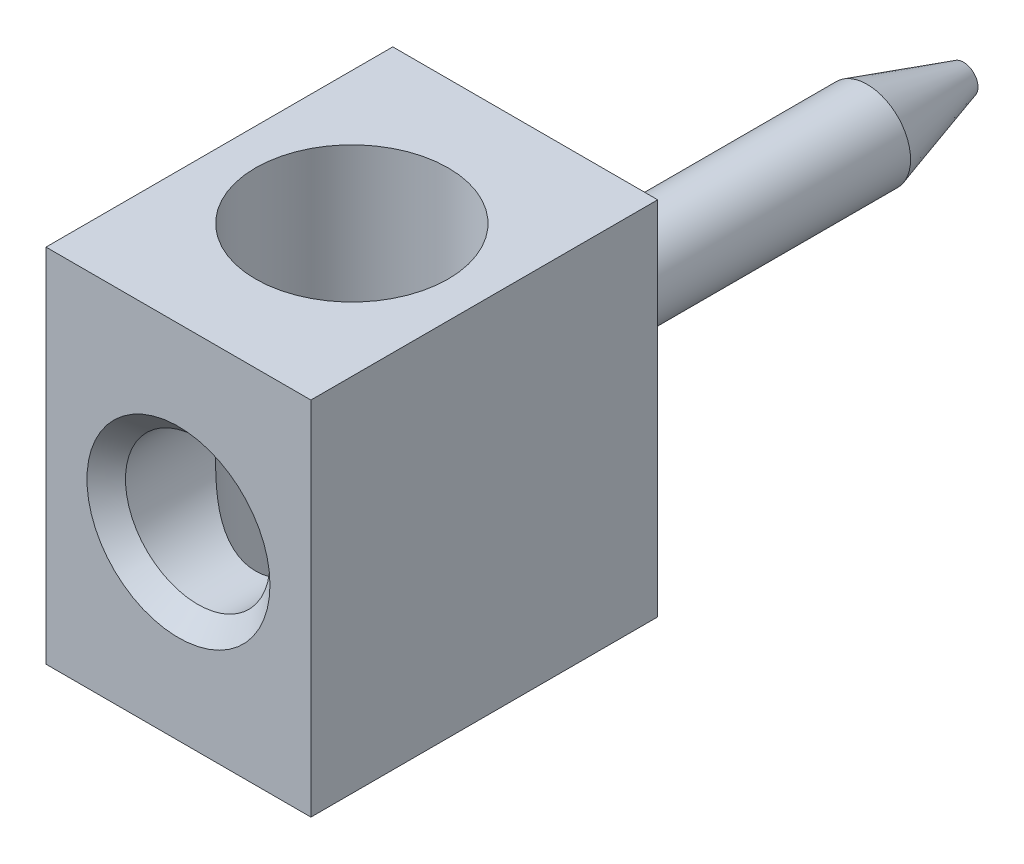
ISO-10303-21;
HEADER;
FILE_DESCRIPTION(('STEP AP214'),'2;1');
FILE_NAME('part.step','',(''),(''),'','','');
FILE_SCHEMA(('AUTOMOTIVE_DESIGN { 1 0 10303 214 1 1 1 1 }'));
ENDSEC;
DATA;
#1=APPLICATION_CONTEXT('core data for automotive mechanical design processes');
#2=APPLICATION_PROTOCOL_DEFINITION('international standard','automotive_design',2000,#1);
#3=PRODUCT_CONTEXT('',#1,'mechanical');
#4=PRODUCT('Part','Part','',(#3));
#5=PRODUCT_RELATED_PRODUCT_CATEGORY('part','',(#4));
#6=PRODUCT_DEFINITION_FORMATION('','',#4);
#7=PRODUCT_DEFINITION_CONTEXT('part definition',#1,'design');
#8=PRODUCT_DEFINITION('design','',#6,#7);
#9=PRODUCT_DEFINITION_SHAPE('','',#8);
#10=(LENGTH_UNIT() NAMED_UNIT(*) SI_UNIT(.MILLI.,.METRE.));
#11=(NAMED_UNIT(*) PLANE_ANGLE_UNIT() SI_UNIT($,.RADIAN.));
#12=(NAMED_UNIT(*) SI_UNIT($,.STERADIAN.) SOLID_ANGLE_UNIT());
#13=UNCERTAINTY_MEASURE_WITH_UNIT(LENGTH_MEASURE(1.E-05),#10,'distance_accuracy_value','');
#14=(GEOMETRIC_REPRESENTATION_CONTEXT(3) GLOBAL_UNCERTAINTY_ASSIGNED_CONTEXT((#13)) GLOBAL_UNIT_ASSIGNED_CONTEXT((#10,
#11,#12)) REPRESENTATION_CONTEXT('',''));
#15=CARTESIAN_POINT('',(0.,0.,0.));
#16=DIRECTION('',(0.,0.,1.));
#17=DIRECTION('',(1.,0.,0.));
#18=AXIS2_PLACEMENT_3D('',#15,#16,#17);
#19=CARTESIAN_POINT('',(0.,0.,1.8));
#20=DIRECTION('',(0.,0.,1.));
#21=DIRECTION('',(1.,0.,0.));
#22=AXIS2_PLACEMENT_3D('',#19,#20,#21);
#23=CONICAL_SURFACE('',#22,0.95,0.785398163397);
#24=CARTESIAN_POINT('',(0.,0.,1.8));
#25=DIRECTION('',(0.,0.,1.));
#26=DIRECTION('',(1.,0.,0.));
#27=AXIS2_PLACEMENT_3D('',#24,#25,#26);
#28=CIRCLE('',#27,0.95);
#29=CARTESIAN_POINT('',(0.949999999999999,0.,1.8));
#30=VERTEX_POINT('',#29);
#31=EDGE_CURVE('E101',#30,#30,#28,.T.);
#32=ORIENTED_EDGE('',*,*,#31,.T.);
#33=EDGE_LOOP('',(#32));
#34=FACE_BOUND('',#33,.T.);
#35=CARTESIAN_POINT('',(0.,0.,1.6));
#36=DIRECTION('',(0.,0.,1.));
#37=DIRECTION('',(1.,0.,0.));
#38=AXIS2_PLACEMENT_3D('',#35,#36,#37);
#39=CIRCLE('',#38,0.75);
#40=CARTESIAN_POINT('',(0.749999999999999,0.,1.6));
#41=VERTEX_POINT('',#40);
#42=EDGE_CURVE('E11',#41,#41,#39,.T.);
#43=ORIENTED_EDGE('',*,*,#42,.F.);
#44=EDGE_LOOP('',(#43));
#45=FACE_BOUND('',#44,.T.);
#46=ADVANCED_FACE('F17',(#34,#45),#23,.F.);
#47=CARTESIAN_POINT('',(0.,0.,-7.583362936602));
#48=DIRECTION('',(0.,0.,1.));
#49=DIRECTION('',(1.,0.,0.));
#50=AXIS2_PLACEMENT_3D('',#47,#48,#49);
#51=CYLINDRICAL_SURFACE('',#50,0.75);
#52=ORIENTED_EDGE('',*,*,#42,.T.);
#53=EDGE_LOOP('',(#52));
#54=FACE_BOUND('',#53,.T.);
#55=CARTESIAN_POINT('',(0.75,0.,0.661437827766));
#56=CARTESIAN_POINT('',(0.75,0.02602566762675,0.661437827766));
#57=CARTESIAN_POINT('',(0.748650287201,0.05163079736881,0.662976601914));
#58=CARTESIAN_POINT('',(0.743453424181,0.102078390645,0.66879909785));
#59=CARTESIAN_POINT('',(0.739605727911,0.126920973286,0.673081529733));
#60=CARTESIAN_POINT('',(0.732031435846,0.163665416288,0.681281015104));
#61=CARTESIAN_POINT('',(0.729205431609,0.175826913813,0.684309947914));
#62=CARTESIAN_POINT('',(0.724516592979,0.193944896234,0.689261106602));
#63=CARTESIAN_POINT('',(0.722877566167,0.199967211152,0.690980557535));
#64=CARTESIAN_POINT('',(0.719454025136,0.211955879748,0.694544459653));
#65=CARTESIAN_POINT('',(0.710561777296,0.241670760401,0.703735189954));
#66=CARTESIAN_POINT('',(0.7000590339,0.270177682977,0.714202664637));
#67=CARTESIAN_POINT('',(0.681307230409,0.314482255645,0.732112392268));
#68=CARTESIAN_POINT('',(0.670956763287,0.335980408668,0.741649409926));
#69=CARTESIAN_POINT('',(0.656807512615,0.362131543362,0.754067681288));
#70=CARTESIAN_POINT('',(0.653916882669,0.367325515567,0.756576387839));
#71=CARTESIAN_POINT('',(0.648013863751,0.377642342279,0.761638541718));
#72=CARTESIAN_POINT('',(0.63896503154,0.39302925116,0.769308253761));
#73=CARTESIAN_POINT('',(0.616755098928,0.427879498511,0.787463253298));
#74=CARTESIAN_POINT('',(0.595860509005,0.45606590362,0.803293014242));
#75=CARTESIAN_POINT('',(0.566318559714,0.492269381092,0.824386257676));
#76=CARTESIAN_POINT('',(0.550706389103,0.509681434976,0.834927243628));
#77=CARTESIAN_POINT('',(0.525954437894,0.534799123315,0.850568742987));
#78=CARTESIAN_POINT('',(0.517481001106,0.543004424655,0.85575444396));
#79=CARTESIAN_POINT('',(0.504422733366,0.555061081313,0.863471638086));
#80=CARTESIAN_POINT('',(0.500006439541,0.559042819509,0.866036912556));
#81=CARTESIAN_POINT('',(0.49108531458,0.566895781296,0.871126665541));
#82=CARTESIAN_POINT('',(0.468568882827,0.586243868175,0.883744849637));
#83=CARTESIAN_POINT('',(0.426120223346,0.618558168328,0.90544271352));
#84=CARTESIAN_POINT('',(0.365272579557,0.656360616188,0.93172064252));
#85=CARTESIAN_POINT('',(0.321688987228,0.677956269967,0.947142130238));
#86=CARTESIAN_POINT('',(0.287756091408,0.692711021264,0.957777080902));
#87=CARTESIAN_POINT('',(0.276237111096,0.697388314027,0.96116660974));
#88=CARTESIAN_POINT('',(0.258627225362,0.704025076843,0.965996380225));
#89=CARTESIAN_POINT('',(0.252694465285,0.706176457146,0.967565598675));
#90=CARTESIAN_POINT('',(0.240797223879,0.710321533995,0.970594942766));
#91=CARTESIAN_POINT('',(0.210932546231,0.720305370476,0.977907612507));
#92=CARTESIAN_POINT('',(0.156082148104,0.734887058441,0.988697701292));
#93=CARTESIAN_POINT('',(0.105725716211,0.742956991699,0.994726977382));
#94=CARTESIAN_POINT('',(0.07372348203251,0.746395529769,0.997299392665));
#95=CARTESIAN_POINT('',(0.06729649672891,0.747002752308,0.997753973072));
#96=CARTESIAN_POINT('',(0.0543884397587,0.748053359091,0.998540788788));
#97=CARTESIAN_POINT('',(0.04790276248116,0.748496658546,0.998872960776));
#98=CARTESIAN_POINT('',(0.02850809529909,0.749570504894,0.999677600111));
#99=CARTESIAN_POINT('',(-0.01017062878048,0.750701923532,1.000527000099));
#100=CARTESIAN_POINT('',(-0.07409585026591,0.747639797877,0.99822773298));
#101=CARTESIAN_POINT('',(-0.124672712847,0.740010377704,0.99252385187));
#102=CARTESIAN_POINT('',(-0.156106224532,0.733602080109,0.98776073863));
#103=CARTESIAN_POINT('',(-0.16238538321,0.732237556064,0.986747641878));
#104=CARTESIAN_POINT('',(-0.174841158899,0.729363760175,0.984616952151));
#105=CARTESIAN_POINT('',(-0.193403669406,0.724830332206,0.981259725436));
#106=CARTESIAN_POINT('',(-0.23588372047,0.712715333709,0.972327597967));
#107=CARTESIAN_POINT('',(-0.27093013973,0.69979314304,0.962894274347));
#108=CARTESIAN_POINT('',(-0.30511816606,0.685241782625,0.952389119943));
#109=CARTESIAN_POINT('',(-0.316370812544,0.68011915987,0.948708499615));
#110=CARTESIAN_POINT('',(-0.338594710231,0.669332641409,0.941005807886));
#111=CARTESIAN_POINT('',(-0.349581904328,0.663658449689,0.936976587309));
#112=CARTESIAN_POINT('',(-0.381810488282,0.646003281923,0.924526670082));
#113=CARTESIAN_POINT('',(-0.423040534868,0.6206912306,0.906900865566));
#114=CARTESIAN_POINT('',(-0.461084680935,0.592001129523,0.887600343845));
#115=CARTESIAN_POINT('',(-0.488492163785,0.569224482088,0.872630373794));
#116=CARTESIAN_POINT('',(-0.497439975777,0.561421870876,0.86755790697));
#117=CARTESIAN_POINT('',(-0.510584814223,0.549398224547,0.859842404367));
#118=CARTESIAN_POINT('',(-0.514924707327,0.545332662834,0.857250032616));
#119=CARTESIAN_POINT('',(-0.523483793829,0.537122185209,0.852050410305));
#120=CARTESIAN_POINT('',(-0.544583793378,0.516391912353,0.839011749899));
#121=CARTESIAN_POINT('',(-0.564238474505,0.49465298304,0.825812968263));
#122=CARTESIAN_POINT('',(-0.593953075278,0.45854811537,0.80470606996));
#123=CARTESIAN_POINT('',(-0.607943754411,0.439834745886,0.794157319763));
#124=CARTESIAN_POINT('',(-0.634240782515,0.400984840125,0.773317584732));
#125=CARTESIAN_POINT('',(-0.646547450885,0.380849211908,0.763025406177));
#126=CARTESIAN_POINT('',(-0.660865114163,0.354673441667,0.750514424152));
#127=CARTESIAN_POINT('',(-0.666491949399,0.344087802344,0.745539600789));
#128=CARTESIAN_POINT('',(-0.677236456238,0.32264892898,0.735826139501));
#129=CARTESIAN_POINT('',(-0.684725406808,0.306261539943,0.728830526249));
#130=CARTESIAN_POINT('',(-0.698944370326,0.273050950361,0.71529577244));
#131=CARTESIAN_POINT('',(-0.707415143808,0.25033182531,0.706878045637));
#132=CARTESIAN_POINT('',(-0.718553442751,0.215247536625,0.695492012307));
#133=CARTESIAN_POINT('',(-0.722004095885,0.203384617247,0.69190417938));
#134=CARTESIAN_POINT('',(-0.728360920162,0.179291904413,0.685209221989));
#135=CARTESIAN_POINT('',(-0.731269001835,0.167053314298,0.68210006178));
#136=CARTESIAN_POINT('',(-0.739121163645,0.129786582149,0.673616578446));
#137=CARTESIAN_POINT('',(-0.743094628549,0.104693630093,0.669198603411));
#138=CARTESIAN_POINT('',(-0.748489899484,0.05397456374154,0.663158554311));
#139=CARTESIAN_POINT('',(-0.749911868036,0.02834833120601,0.661537758842));
#140=CARTESIAN_POINT('',(-0.750017086465,-0.00404164164992,0.661418453797));
#141=CARTESIAN_POINT('',(-0.749954149899,-0.0105427948587,0.661489851079));
#142=CARTESIAN_POINT('',(-0.749658210156,-0.02355903003195,0.661825305557));
#143=CARTESIAN_POINT('',(-0.748962720856,-0.04300631739595,0.662614541995));
#144=CARTESIAN_POINT('',(-0.745604160181,-0.08785555225005,0.666403350035));
#145=CARTESIAN_POINT('',(-0.739865748933,-0.125437710064,0.672795715659));
#146=CARTESIAN_POINT('',(-0.732293039002,-0.162498896663,0.680999820406));
#147=CARTESIAN_POINT('',(-0.729460195169,-0.1747737985,0.684038456656));
#148=CARTESIAN_POINT('',(-0.723192630869,-0.199124271838,0.690661425865));
#149=CARTESIAN_POINT('',(-0.71978721489,-0.211088599744,0.694214606977));
#150=CARTESIAN_POINT('',(-0.708795572391,-0.246408123244,0.705492067703));
#151=CARTESIAN_POINT('',(-0.700437387139,-0.26919274393,0.713830659486));
#152=CARTESIAN_POINT('',(-0.68177162383,-0.313472039624,0.73167902571));
#153=CARTESIAN_POINT('',(-0.671463219045,-0.334965879889,0.741190021508));
#154=CARTESIAN_POINT('',(-0.654544521324,-0.366350540344,0.756060741762));
#155=CARTESIAN_POINT('',(-0.648661560201,-0.376668840145,0.761119029072));
#156=CARTESIAN_POINT('',(-0.639466730964,-0.39194082295,0.768829174144));
#157=CARTESIAN_POINT('',(-0.636339398679,-0.396997828536,0.771420121978));
#158=CARTESIAN_POINT('',(-0.62998791028,-0.407002103716,0.776615774168));
#159=CARTESIAN_POINT('',(-0.613849203625,-0.431764017996,0.789654465202));
#160=CARTESIAN_POINT('',(-0.596423643688,-0.455331438352,0.802875359908));
#161=CARTESIAN_POINT('',(-0.566869560823,-0.49163684007,0.824007832069));
#162=CARTESIAN_POINT('',(-0.551255940535,-0.50908776907,0.834564527967));
#163=CARTESIAN_POINT('',(-0.526513169118,-0.534249239487,0.850222999321));
#164=CARTESIAN_POINT('',(-0.513810524985,-0.546575496979,0.858008396183));
#165=CARTESIAN_POINT('',(-0.500590801115,-0.558519742927,0.865699312609));
#166=CARTESIAN_POINT('',(-0.49166004638,-0.56639725652,0.870802416628));
#167=CARTESIAN_POINT('',(-0.487139945742,-0.570289505401,0.873339424384));
#168=CARTESIAN_POINT('',(-0.464352493839,-0.589443816668,0.885895743256));
#169=CARTESIAN_POINT('',(-0.426539181401,-0.618275034943,0.905248303047));
#170=CARTESIAN_POINT('',(-0.365620878523,-0.656169083933,0.931585307698));
#171=CARTESIAN_POINT('',(-0.322036662449,-0.677790773795,0.947023633774));
#172=CARTESIAN_POINT('',(-0.288127278148,-0.692556609844,0.957665398409));
#173=CARTESIAN_POINT('',(-0.27662015299,-0.69723619801,0.961056241406));
#174=CARTESIAN_POINT('',(-0.253173495511,-0.706087959129,0.967497281317));
#175=CARTESIAN_POINT('',(-0.241200869149,-0.710268859294,0.970553948581));
#176=CARTESIAN_POINT('',(-0.205101093006,-0.721853777602,0.97905346424));
#177=CARTESIAN_POINT('',(-0.156225369406,-0.734861050831,0.988678285627));
#178=CARTESIAN_POINT('',(-0.105829263193,-0.742942140852,0.994715881302));
#179=CARTESIAN_POINT('',(-0.07383140823809,-0.746384854989,0.997291403251));
#180=CARTESIAN_POINT('',(-0.06740676286307,-0.746992777443,0.997746504912));
#181=CARTESIAN_POINT('',(-0.05450644082115,-0.748044737393,0.998534329732));
#182=CARTESIAN_POINT('',(-0.04802198457702,-0.748489239453,0.998867401006));
#183=CARTESIAN_POINT('',(-0.02855124134945,-0.74956975387,0.999677035198));
#184=CARTESIAN_POINT('',(0.01026148432835,-0.750705402759,1.000529461591));
#185=CARTESIAN_POINT('',(0.07432345799523,-0.747620676635,0.998213364394));
#186=CARTESIAN_POINT('',(0.124922505937,-0.739967955244,0.992492207271));
#187=CARTESIAN_POINT('',(0.156343492353,-0.733551532173,0.987723196687));
#188=CARTESIAN_POINT('',(0.162627616681,-0.732183971322,0.986707874315));
#189=CARTESIAN_POINT('',(0.175121690234,-0.729296633693,0.984567224286));
#190=CARTESIAN_POINT('',(0.193737527359,-0.724742293857,0.981194664367));
#191=CARTESIAN_POINT('',(0.236314586432,-0.712575953522,0.972225247197));
#192=CARTESIAN_POINT('',(0.27140226938,-0.699610903687,0.962761714414));
#193=CARTESIAN_POINT('',(0.305608600684,-0.68502338302,0.952231962722));
#194=CARTESIAN_POINT('',(0.322490990927,-0.677323100437,0.946700139548));
#195=CARTESIAN_POINT('',(0.339048823327,-0.669017194443,0.940786912095));
#196=CARTESIAN_POINT('',(0.350015793518,-0.663345351493,0.936762009721));
#197=CARTESIAN_POINT('',(0.355461615646,-0.660442841244,0.934708701247));
#198=CARTESIAN_POINT('',(0.382376810108,-0.645670595741,0.924293921998));
#199=CARTESIAN_POINT('',(0.423667867034,-0.620267591559,0.906609871237));
#200=CARTESIAN_POINT('',(0.46172396986,-0.591503348336,0.887268055712));
#201=CARTESIAN_POINT('',(0.48912608678,-0.56868003314,0.872275230641));
#202=CARTESIAN_POINT('',(0.498069707293,-0.56086335309,0.867196492612));
#203=CARTESIAN_POINT('',(0.515583512513,-0.544807099612,0.85689954589));
#204=CARTESIAN_POINT('',(0.52416779557,-0.536552192741,0.85167195398));
#205=CARTESIAN_POINT('',(0.549176198305,-0.511337498143,0.835938684147));
#206=CARTESIAN_POINT('',(0.564910845999,-0.493886961416,0.825353433268));
#207=CARTESIAN_POINT('',(0.594627619796,-0.457675199634,0.804208025022));
#208=CARTESIAN_POINT('',(0.608609539424,-0.438914305515,0.793646989426));
#209=CARTESIAN_POINT('',(0.634873331433,-0.399983989802,0.772798142038));
#210=CARTESIAN_POINT('',(0.647155500732,-0.37981543949,0.762509147306));
#211=CARTESIAN_POINT('',(0.661434703372,-0.353609613578,0.750012357093));
#212=CARTESIAN_POINT('',(0.664236678211,-0.348318437748,0.747531426811));
#213=CARTESIAN_POINT('',(0.669731803894,-0.337632062472,0.742612220209));
#214=CARTESIAN_POINT('',(0.67242123198,-0.332243746656,0.740177224017));
#215=CARTESIAN_POINT('',(0.68028905247,-0.315993175122,0.732978410164));
#216=CARTESIAN_POINT('',(0.685277830385,-0.305024830452,0.728311094839));
#217=CARTESIAN_POINT('',(0.699476129282,-0.27169201792,0.714775606253));
#218=CARTESIAN_POINT('',(0.707920988675,-0.248902008838,0.706370798914));
#219=CARTESIAN_POINT('',(0.722700818228,-0.202009562996,0.691241896225));
#220=CARTESIAN_POINT('',(0.729037025513,-0.177907869003,0.684516893264));
#221=CARTESIAN_POINT('',(0.735520158115,-0.146800831597,0.677505531058));
#222=CARTESIAN_POINT('',(0.736742662056,-0.140537771596,0.676175352607));
#223=CARTESIAN_POINT('',(0.739024550183,-0.127997655334,0.673680696391));
#224=CARTESIAN_POINT('',(0.742208761218,-0.109136759526,0.670180321701));
#225=CARTESIAN_POINT('',(0.746320999338,-0.07744367950891,0.665594750873));
#226=CARTESIAN_POINT('',(0.748820117014,-0.04539306606854,0.662774427354));
#227=CARTESIAN_POINT('',(0.749703638354,-0.0227628314978,0.661773790995));
#228=CARTESIAN_POINT('',(0.74989400107,-0.0130216485994,0.661558002945));
#229=CARTESIAN_POINT('',(0.749978727645,-0.006517994617038,0.661461950669));
#230=CARTESIAN_POINT('',(0.75,-0.003253208453344,0.661437827766));
#231=CARTESIAN_POINT('',(0.75,0.,0.661437827766));
#232=B_SPLINE_CURVE_WITH_KNOTS('',3,(#55,#56,#57,#58,#59,#60,#61,#62,#63,#64,#65,#66,#67,#68,
#69,#70,#71,#72,#73,#74,#75,#76,#77,#78,#79,#80,#81,#82,#83,#84,#85,#86,#87,#88,#89,#90,#91,#92,
#93,#94,#95,#96,#97,#98,#99,#100,#101,#102,#103,#104,#105,#106,#107,#108,#109,#110,#111,#112,
#113,#114,#115,#116,#117,#118,#119,#120,#121,#122,#123,#124,#125,#126,#127,#128,#129,#130,#131,
#132,#133,#134,#135,#136,#137,#138,#139,#140,#141,#142,#143,#144,#145,#146,#147,#148,#149,#150,
#151,#152,#153,#154,#155,#156,#157,#158,#159,#160,#161,#162,#163,#164,#165,#166,#167,#168,#169,
#170,#171,#172,#173,#174,#175,#176,#177,#178,#179,#180,#181,#182,#183,#184,#185,#186,#187,#188,
#189,#190,#191,#192,#193,#194,#195,#196,#197,#198,#199,#200,#201,#202,#203,#204,#205,#206,#207,
#208,#209,#210,#211,#212,#213,#214,#215,#216,#217,#218,#219,#220,#221,#222,#223,#224,#225,#226,
#227,#228,#229,#230,#231),.UNSPECIFIED.,.T.,.F.,(4,2,2,2,2,1,2,2,2,1,1,2,2,2,2,1,1,1,2,2,2,1,1,
2,2,2,1,1,2,2,1,1,2,2,2,1,2,2,2,1,2,2,2,1,1,2,2,2,2,2,2,2,1,1,2,2,2,2,2,2,2,1,2,2,1,2,2,1,1,2,2,
2,1,2,2,2,1,1,2,2,1,1,2,1,2,2,1,2,2,2,2,2,2,2,2,2,2,2,2,1,1,1,1,2,4),(0.,0.015625,0.03125,
0.0390625,0.04296875,0.046875,0.0625,0.078125,0.08203125,0.0859375,0.09375,0.109375,0.125,
0.1328125,0.13671875,0.140625,0.15625,0.171875,0.1875,0.1953125,0.19921875,0.203125,0.21875,
0.234375,0.23828125,0.2421875,0.25,0.265625,0.28125,0.28515625,0.2890625,0.296875,0.3125,
0.3203125,0.328125,0.34375,0.359375,0.3671875,0.37109375,0.375,0.390625,0.40625,0.421875,
0.42578125,0.4296875,0.4375,0.453125,0.4609375,0.46875,0.484375,0.5,0.50390625,0.5078125,
0.515625,0.53125,0.5390625,0.546875,0.5625,0.578125,0.5859375,0.58984375,0.59375,0.609375,0.625,
0.6328125,0.63671875,0.640625,0.65625,0.671875,0.6875,0.6953125,0.703125,0.71875,0.734375,
0.73828125,0.7421875,0.75,0.765625,0.78125,0.78515625,0.7890625,0.796875,0.8125,0.8203125,
0.82421875,0.828125,0.84375,0.859375,0.8671875,0.875,0.890625,0.90625,0.921875,0.92578125,
0.9296875,0.9375,0.953125,0.96875,0.97265625,0.9765625,0.984375,0.9921875,0.99609375,
0.998046875,1.),.UNSPECIFIED.);
#233=CARTESIAN_POINT('',(0.75,0.,0.661437827766));
#234=VERTEX_POINT('',#233);
#235=EDGE_CURVE('E20',#234,#234,#232,.T.);
#236=ORIENTED_EDGE('',*,*,#235,.F.);
#237=EDGE_LOOP('',(#236));
#238=FACE_BOUND('',#237,.T.);
#239=ADVANCED_FACE('F158',(#54,#238),#51,.F.);
#240=CARTESIAN_POINT('',(0.,0.,-5.35));
#241=DIRECTION('',(0.,0.,1.));
#242=DIRECTION('',(1.,0.,0.));
#243=AXIS2_PLACEMENT_3D('',#240,#241,#242);
#244=CONICAL_SURFACE('',#243,0.45,0.291456794478);
#245=CARTESIAN_POINT('',(0.,0.,-5.35));
#246=DIRECTION('',(0.,0.,1.));
#247=DIRECTION('',(1.,0.,0.));
#248=AXIS2_PLACEMENT_3D('',#245,#246,#247);
#249=CIRCLE('',#248,0.45);
#250=CARTESIAN_POINT('',(0.450000000000001,0.,-5.35));
#251=VERTEX_POINT('',#250);
#252=EDGE_CURVE('E136',#251,#251,#249,.T.);
#253=CARTESIAN_POINT('',(0.,0.,-6.35));
#254=DIRECTION('',(0.,0.,1.));
#255=DIRECTION('',(1.,0.,0.));
#256=AXIS2_PLACEMENT_3D('',#253,#254,#255);
#257=CIRCLE('',#256,0.15);
#258=CARTESIAN_POINT('',(0.149999999999856,0.,-6.35));
#259=VERTEX_POINT('',#258);
#260=EDGE_CURVE('E29',#259,#259,#257,.T.);
#261=CARTESIAN_POINT('',(0.450000000000001,0.,-5.35));
#262=CARTESIAN_POINT('',(0.446874999999999,0.,-5.36041666666667));
#263=CARTESIAN_POINT('',(0.443749999999998,0.,-5.37083333333333));
#264=CARTESIAN_POINT('',(0.437499999999995,0.,-5.39166666666666));
#265=CARTESIAN_POINT('',(0.434374999999993,0.,-5.40208333333333));
#266=CARTESIAN_POINT('',(0.42812499999999,0.,-5.42291666666667));
#267=CARTESIAN_POINT('',(0.424999999999989,0.,-5.43333333333333));
#268=CARTESIAN_POINT('',(0.418749999999986,0.,-5.45416666666667));
#269=CARTESIAN_POINT('',(0.415624999999984,0.,-5.46458333333333));
#270=CARTESIAN_POINT('',(0.409374999999981,0.,-5.48541666666667));
#271=CARTESIAN_POINT('',(0.40624999999998,0.,-5.49583333333333));
#272=CARTESIAN_POINT('',(0.399999999999977,0.,-5.51666666666667));
#273=CARTESIAN_POINT('',(0.396874999999975,0.,-5.52708333333333));
#274=CARTESIAN_POINT('',(0.390624999999972,0.,-5.54791666666667));
#275=CARTESIAN_POINT('',(0.387499999999971,0.,-5.55833333333333));
#276=CARTESIAN_POINT('',(0.381249999999968,0.,-5.57916666666667));
#277=CARTESIAN_POINT('',(0.378124999999966,0.,-5.58958333333333));
#278=CARTESIAN_POINT('',(0.371874999999963,0.,-5.61041666666667));
#279=CARTESIAN_POINT('',(0.368749999999962,0.,-5.62083333333333));
#280=CARTESIAN_POINT('',(0.362499999999959,0.,-5.64166666666667));
#281=CARTESIAN_POINT('',(0.359374999999957,0.,-5.65208333333333));
#282=CARTESIAN_POINT('',(0.353124999999954,0.,-5.67291666666667));
#283=CARTESIAN_POINT('',(0.349999999999953,0.,-5.68333333333333));
#284=CARTESIAN_POINT('',(0.34374999999995,0.,-5.70416666666667));
#285=CARTESIAN_POINT('',(0.340624999999948,0.,-5.71458333333333));
#286=CARTESIAN_POINT('',(0.334374999999945,0.,-5.73541666666667));
#287=CARTESIAN_POINT('',(0.331249999999944,0.,-5.74583333333333));
#288=CARTESIAN_POINT('',(0.324999999999941,0.,-5.76666666666667));
#289=CARTESIAN_POINT('',(0.321874999999939,0.,-5.77708333333333));
#290=CARTESIAN_POINT('',(0.315624999999936,0.,-5.79791666666667));
#291=CARTESIAN_POINT('',(0.312499999999935,0.,-5.80833333333333));
#292=CARTESIAN_POINT('',(0.306249999999932,0.,-5.82916666666667));
#293=CARTESIAN_POINT('',(0.30312499999993,0.,-5.83958333333333));
#294=CARTESIAN_POINT('',(0.296874999999927,0.,-5.86041666666667));
#295=CARTESIAN_POINT('',(0.293749999999926,0.,-5.87083333333333));
#296=CARTESIAN_POINT('',(0.287499999999923,0.,-5.89166666666667));
#297=CARTESIAN_POINT('',(0.284374999999921,0.,-5.90208333333333));
#298=CARTESIAN_POINT('',(0.278124999999918,0.,-5.92291666666667));
#299=CARTESIAN_POINT('',(0.274999999999917,0.,-5.93333333333333));
#300=CARTESIAN_POINT('',(0.268749999999914,0.,-5.95416666666667));
#301=CARTESIAN_POINT('',(0.265624999999912,0.,-5.96458333333333));
#302=CARTESIAN_POINT('',(0.259374999999909,0.,-5.98541666666667));
#303=CARTESIAN_POINT('',(0.256249999999907,0.,-5.99583333333333));
#304=CARTESIAN_POINT('',(0.249999999999904,0.,-6.01666666666667));
#305=CARTESIAN_POINT('',(0.246874999999903,0.,-6.02708333333333));
#306=CARTESIAN_POINT('',(0.2406249999999,0.,-6.04791666666667));
#307=CARTESIAN_POINT('',(0.237499999999898,0.,-6.05833333333333));
#308=CARTESIAN_POINT('',(0.231249999999895,0.,-6.07916666666667));
#309=CARTESIAN_POINT('',(0.228124999999894,0.,-6.08958333333333));
#310=CARTESIAN_POINT('',(0.221874999999891,0.,-6.11041666666667));
#311=CARTESIAN_POINT('',(0.218749999999889,0.,-6.12083333333333));
#312=CARTESIAN_POINT('',(0.212499999999886,0.,-6.14166666666667));
#313=CARTESIAN_POINT('',(0.209374999999885,0.,-6.15208333333333));
#314=CARTESIAN_POINT('',(0.203124999999882,0.,-6.17291666666667));
#315=CARTESIAN_POINT('',(0.19999999999988,0.,-6.18333333333333));
#316=CARTESIAN_POINT('',(0.193749999999877,0.,-6.20416666666667));
#317=CARTESIAN_POINT('',(0.190624999999876,0.,-6.21458333333333));
#318=CARTESIAN_POINT('',(0.184374999999873,0.,-6.23541666666667));
#319=CARTESIAN_POINT('',(0.181249999999871,0.,-6.24583333333333));
#320=CARTESIAN_POINT('',(0.174999999999868,0.,-6.26666666666667));
#321=CARTESIAN_POINT('',(0.171874999999867,0.,-6.27708333333333));
#322=CARTESIAN_POINT('',(0.165624999999864,0.,-6.29791666666667));
#323=CARTESIAN_POINT('',(0.162499999999862,0.,-6.30833333333333));
#324=CARTESIAN_POINT('',(0.156249999999859,0.,-6.32916666666667));
#325=CARTESIAN_POINT('',(0.153124999999858,0.,-6.33958333333333));
#326=CARTESIAN_POINT('',(0.149999999999856,0.,-6.35));
#327=B_SPLINE_CURVE_WITH_KNOTS('',3,(#261,#262,#263,#264,#265,#266,#267,#268,#269,#270,#271,
#272,#273,#274,#275,#276,#277,#278,#279,#280,#281,#282,#283,#284,#285,#286,#287,#288,#289,#290,
#291,#292,#293,#294,#295,#296,#297,#298,#299,#300,#301,#302,#303,#304,#305,#306,#307,#308,#309,
#310,#311,#312,#313,#314,#315,#316,#317,#318,#319,#320,#321,#322,#323,#324,#325,#326),
.UNSPECIFIED.,.F.,.F.,(4,2,2,2,2,2,2,2,2,2,2,2,2,2,2,2,2,2,2,2,2,2,2,2,2,2,2,2,2,2,2,2,4),(0.,
0.032625957840346,0.0652519156806928,0.0978778735210396,0.130503831361386,0.163129789201733,
0.19575574704208,0.228381704882427,0.261007662722774,0.29363362056312,0.326259578403467,
0.358885536243814,0.391511494084161,0.424137451924508,0.456763409764854,0.489389367605201,
0.522015325445548,0.554641283285895,0.587267241126241,0.619893198966588,0.652519156806935,
0.685145114647282,0.717771072487629,0.750397030327975,0.783022988168322,0.815648946008669,
0.848274903849016,0.880900861689363,0.913526819529709,0.946152777370056,0.978778735210403,
1.01140469305075,1.0440306508911),.UNSPECIFIED.);
#328=EDGE_CURVE('BSEAM145',#251,#259,#327,.T.);
#329=ORIENTED_EDGE('',*,*,#252,.F.);
#330=ORIENTED_EDGE('',*,*,#260,.T.);
#331=ORIENTED_EDGE('',*,*,#328,.T.);
#332=ORIENTED_EDGE('',*,*,#328,.F.);
#333=EDGE_LOOP('',(#329,#331,#330,#332));
#334=FACE_BOUND('',#333,.T.);
#335=ADVANCED_FACE('F145',(#334),#244,.T.);
#336=CARTESIAN_POINT('',(0.,0.,-6.35));
#337=DIRECTION('',(0.,0.,1.));
#338=DIRECTION('',(1.,0.,0.));
#339=AXIS2_PLACEMENT_3D('',#336,#337,#338);
#340=PLANE('',#339);
#341=ORIENTED_EDGE('',*,*,#260,.F.);
#342=EDGE_LOOP('',(#341));
#343=FACE_BOUND('',#342,.T.);
#344=ADVANCED_FACE('F147',(#343),#340,.F.);
#345=CARTESIAN_POINT('',(0.,0.,-6.35));
#346=DIRECTION('',(0.,0.,1.));
#347=DIRECTION('',(1.,0.,0.));
#348=AXIS2_PLACEMENT_3D('',#345,#346,#347);
#349=CYLINDRICAL_SURFACE('',#348,0.45);
#350=CARTESIAN_POINT('',(0.,0.,-1.8));
#351=DIRECTION('',(0.,0.,-1.));
#352=DIRECTION('',(-1.,0.,0.));
#353=AXIS2_PLACEMENT_3D('',#350,#351,#352);
#354=CIRCLE('',#353,0.45);
#355=CARTESIAN_POINT('',(-0.45,0.,-1.8));
#356=VERTEX_POINT('',#355);
#357=EDGE_CURVE('E133',#356,#356,#354,.T.);
#358=ORIENTED_EDGE('',*,*,#357,.T.);
#359=EDGE_LOOP('',(#358));
#360=FACE_BOUND('',#359,.T.);
#361=ORIENTED_EDGE('',*,*,#252,.T.);
#362=EDGE_LOOP('',(#361));
#363=FACE_BOUND('',#362,.T.);
#364=ADVANCED_FACE('F149',(#360,#363),#349,.T.);
#365=CARTESIAN_POINT('',(-1.375,-1.875,-1.8));
#366=DIRECTION('',(-1.,0.,0.));
#367=DIRECTION('',(0.,0.,1.));
#368=AXIS2_PLACEMENT_3D('',#365,#366,#367);
#369=PLANE('',#368);
#370=DIRECTION('',(0.,0.,1.));
#371=VECTOR('',#370,1.);
#372=CARTESIAN_POINT('',(-1.375,1.875,-1.8));
#373=LINE('',#372,#371);
#374=CARTESIAN_POINT('',(-1.375,1.875,-1.8));
#375=VERTEX_POINT('',#374);
#376=CARTESIAN_POINT('',(-1.375,1.875,1.8));
#377=VERTEX_POINT('',#376);
#378=EDGE_CURVE('E111',#375,#377,#373,.T.);
#379=ORIENTED_EDGE('',*,*,#378,.F.);
#380=DIRECTION('',(0.,1.,0.));
#381=VECTOR('',#380,1.);
#382=CARTESIAN_POINT('',(-1.375,-1.875,-1.8));
#383=LINE('',#382,#381);
#384=CARTESIAN_POINT('',(-1.375,-1.875,-1.8));
#385=VERTEX_POINT('',#384);
#386=EDGE_CURVE('E41',#385,#375,#383,.T.);
#387=ORIENTED_EDGE('',*,*,#386,.F.);
#388=DIRECTION('',(0.,0.,1.));
#389=VECTOR('',#388,1.);
#390=CARTESIAN_POINT('',(-1.375,-1.875,-1.8));
#391=LINE('',#390,#389);
#392=CARTESIAN_POINT('',(-1.375,-1.875,1.8));
#393=VERTEX_POINT('',#392);
#394=EDGE_CURVE('E72',#385,#393,#391,.T.);
#395=ORIENTED_EDGE('',*,*,#394,.T.);
#396=DIRECTION('',(0.,1.,0.));
#397=VECTOR('',#396,1.);
#398=CARTESIAN_POINT('',(-1.375,-1.875,1.8));
#399=LINE('',#398,#397);
#400=EDGE_CURVE('E76',#393,#377,#399,.T.);
#401=ORIENTED_EDGE('',*,*,#400,.T.);
#402=EDGE_LOOP('',(#379,#387,#395,#401));
#403=FACE_BOUND('',#402,.T.);
#404=ADVANCED_FACE('F74',(#403),#369,.T.);
#405=CARTESIAN_POINT('',(1.375,-1.875,-1.8));
#406=DIRECTION('',(0.,0.,-1.));
#407=DIRECTION('',(0.,-1.,0.));
#408=AXIS2_PLACEMENT_3D('',#405,#406,#407);
#409=PLANE('',#408);
#410=DIRECTION('',(-1.,0.,0.));
#411=VECTOR('',#410,1.);
#412=CARTESIAN_POINT('',(1.375,1.875,-1.8));
#413=LINE('',#412,#411);
#414=CARTESIAN_POINT('',(1.375,1.875,-1.8));
#415=VERTEX_POINT('',#414);
#416=EDGE_CURVE('E108',#415,#375,#413,.T.);
#417=ORIENTED_EDGE('',*,*,#416,.F.);
#418=DIRECTION('',(0.,1.,0.));
#419=VECTOR('',#418,1.);
#420=CARTESIAN_POINT('',(1.375,-1.875,-1.8));
#421=LINE('',#420,#419);
#422=CARTESIAN_POINT('',(1.375,-1.875,-1.8));
#423=VERTEX_POINT('',#422);
#424=EDGE_CURVE('E59',#423,#415,#421,.T.);
#425=ORIENTED_EDGE('',*,*,#424,.F.);
#426=DIRECTION('',(-1.,0.,0.));
#427=VECTOR('',#426,1.);
#428=CARTESIAN_POINT('',(1.375,-1.875,-1.8));
#429=LINE('',#428,#427);
#430=EDGE_CURVE('E80',#423,#385,#429,.T.);
#431=ORIENTED_EDGE('',*,*,#430,.T.);
#432=ORIENTED_EDGE('',*,*,#386,.T.);
#433=EDGE_LOOP('',(#417,#425,#431,#432));
#434=FACE_BOUND('',#433,.T.);
#435=ORIENTED_EDGE('',*,*,#357,.F.);
#436=EDGE_LOOP('',(#435));
#437=FACE_BOUND('',#436,.T.);
#438=ADVANCED_FACE('F286',(#434,#437),#409,.T.);
#439=CARTESIAN_POINT('',(1.375,-1.875,1.8));
#440=DIRECTION('',(1.,0.,0.));
#441=DIRECTION('',(0.,0.,1.));
#442=AXIS2_PLACEMENT_3D('',#439,#440,#441);
#443=PLANE('',#442);
#444=DIRECTION('',(0.,0.,-1.));
#445=VECTOR('',#444,1.);
#446=CARTESIAN_POINT('',(1.375,1.875,1.8));
#447=LINE('',#446,#445);
#448=CARTESIAN_POINT('',(1.375,1.875,1.8));
#449=VERTEX_POINT('',#448);
#450=EDGE_CURVE('E112',#449,#415,#447,.T.);
#451=ORIENTED_EDGE('',*,*,#450,.F.);
#452=DIRECTION('',(0.,1.,0.));
#453=VECTOR('',#452,1.);
#454=CARTESIAN_POINT('',(1.375,-1.875,1.8));
#455=LINE('',#454,#453);
#456=CARTESIAN_POINT('',(1.375,-1.875,1.8));
#457=VERTEX_POINT('',#456);
#458=EDGE_CURVE('E91',#457,#449,#455,.T.);
#459=ORIENTED_EDGE('',*,*,#458,.F.);
#460=DIRECTION('',(0.,0.,-1.));
#461=VECTOR('',#460,1.);
#462=CARTESIAN_POINT('',(1.375,-1.875,1.8));
#463=LINE('',#462,#461);
#464=EDGE_CURVE('E81',#457,#423,#463,.T.);
#465=ORIENTED_EDGE('',*,*,#464,.T.);
#466=ORIENTED_EDGE('',*,*,#424,.T.);
#467=EDGE_LOOP('',(#451,#459,#465,#466));
#468=FACE_BOUND('',#467,.T.);
#469=ADVANCED_FACE('F296',(#468),#443,.T.);
#470=CARTESIAN_POINT('',(0.,1.875,0.));
#471=DIRECTION('',(0.,1.,0.));
#472=DIRECTION('',(1.,0.,0.));
#473=AXIS2_PLACEMENT_3D('',#470,#471,#472);
#474=PLANE('',#473);
#475=CARTESIAN_POINT('',(0.,1.875,0.));
#476=DIRECTION('',(0.,1.,0.));
#477=DIRECTION('',(0.,0.,1.));
#478=AXIS2_PLACEMENT_3D('',#475,#476,#477);
#479=CIRCLE('',#478,1.);
#480=CARTESIAN_POINT('',(0.,1.875,1.));
#481=VERTEX_POINT('',#480);
#482=EDGE_CURVE('E107',#481,#481,#479,.T.);
#483=ORIENTED_EDGE('',*,*,#482,.F.);
#484=EDGE_LOOP('',(#483));
#485=FACE_BOUND('',#484,.T.);
#486=ORIENTED_EDGE('',*,*,#450,.T.);
#487=ORIENTED_EDGE('',*,*,#416,.T.);
#488=ORIENTED_EDGE('',*,*,#378,.T.);
#489=DIRECTION('',(1.,0.,0.));
#490=VECTOR('',#489,1.);
#491=CARTESIAN_POINT('',(-1.375,1.875,1.8));
#492=LINE('',#491,#490);
#493=EDGE_CURVE('E96',#377,#449,#492,.T.);
#494=ORIENTED_EDGE('',*,*,#493,.T.);
#495=EDGE_LOOP('',(#486,#487,#488,#494));
#496=FACE_BOUND('',#495,.T.);
#497=ADVANCED_FACE('F306',(#485,#496),#474,.T.);
#498=CARTESIAN_POINT('',(0.,-1.875,0.));
#499=DIRECTION('',(0.,1.,0.));
#500=DIRECTION('',(1.,0.,0.));
#501=AXIS2_PLACEMENT_3D('',#498,#499,#500);
#502=PLANE('',#501);
#503=CARTESIAN_POINT('',(0.,-1.875,0.));
#504=DIRECTION('',(0.,1.,0.));
#505=DIRECTION('',(1.,0.,0.));
#506=AXIS2_PLACEMENT_3D('',#503,#504,#505);
#507=CIRCLE('',#506,1.);
#508=CARTESIAN_POINT('',(1.,-1.875,0.));
#509=VERTEX_POINT('',#508);
#510=EDGE_CURVE('E117',#509,#509,#507,.T.);
#511=ORIENTED_EDGE('',*,*,#510,.T.);
#512=EDGE_LOOP('',(#511));
#513=FACE_BOUND('',#512,.T.);
#514=ORIENTED_EDGE('',*,*,#464,.F.);
#515=DIRECTION('',(1.,0.,0.));
#516=VECTOR('',#515,1.);
#517=CARTESIAN_POINT('',(-1.375,-1.875,1.8));
#518=LINE('',#517,#516);
#519=EDGE_CURVE('E84',#393,#457,#518,.T.);
#520=ORIENTED_EDGE('',*,*,#519,.F.);
#521=ORIENTED_EDGE('',*,*,#394,.F.);
#522=ORIENTED_EDGE('',*,*,#430,.F.);
#523=EDGE_LOOP('',(#514,#520,#521,#522));
#524=FACE_BOUND('',#523,.T.);
#525=ADVANCED_FACE('F85',(#513,#524),#502,.F.);
#526=CARTESIAN_POINT('',(0.,7.508362936602,0.));
#527=DIRECTION('',(0.,-1.,0.));
#528=DIRECTION('',(0.,0.,-1.));
#529=AXIS2_PLACEMENT_3D('',#526,#527,#528);
#530=CYLINDRICAL_SURFACE('',#529,1.);
#531=ORIENTED_EDGE('',*,*,#510,.F.);
#532=EDGE_LOOP('',(#531));
#533=FACE_BOUND('',#532,.T.);
#534=ORIENTED_EDGE('',*,*,#235,.T.);
#535=EDGE_LOOP('',(#534));
#536=FACE_BOUND('',#535,.T.);
#537=ORIENTED_EDGE('',*,*,#482,.T.);
#538=EDGE_LOOP('',(#537));
#539=FACE_BOUND('',#538,.T.);
#540=ADVANCED_FACE('F327',(#533,#536,#539),#530,.F.);
#541=CARTESIAN_POINT('',(-1.375,-1.875,1.8));
#542=DIRECTION('',(0.,0.,1.));
#543=DIRECTION('',(1.,0.,0.));
#544=AXIS2_PLACEMENT_3D('',#541,#542,#543);
#545=PLANE('',#544);
#546=ORIENTED_EDGE('',*,*,#493,.F.);
#547=ORIENTED_EDGE('',*,*,#400,.F.);
#548=ORIENTED_EDGE('',*,*,#519,.T.);
#549=ORIENTED_EDGE('',*,*,#458,.T.);
#550=EDGE_LOOP('',(#546,#547,#548,#549));
#551=FACE_BOUND('',#550,.T.);
#552=ORIENTED_EDGE('',*,*,#31,.F.);
#553=EDGE_LOOP('',(#552));
#554=FACE_BOUND('',#553,.T.);
#555=ADVANCED_FACE('F93',(#551,#554),#545,.T.);
#556=CLOSED_SHELL('',(#46,#239,#335,#344,#364,#404,#438,#469,#497,#525,#540,#555));
#557=MANIFOLD_SOLID_BREP('B1',#556);
#558=ADVANCED_BREP_SHAPE_REPRESENTATION('',(#18,#557),#14);
#559=SHAPE_DEFINITION_REPRESENTATION(#9,#558);
ENDSEC;
END-ISO-10303-21;
